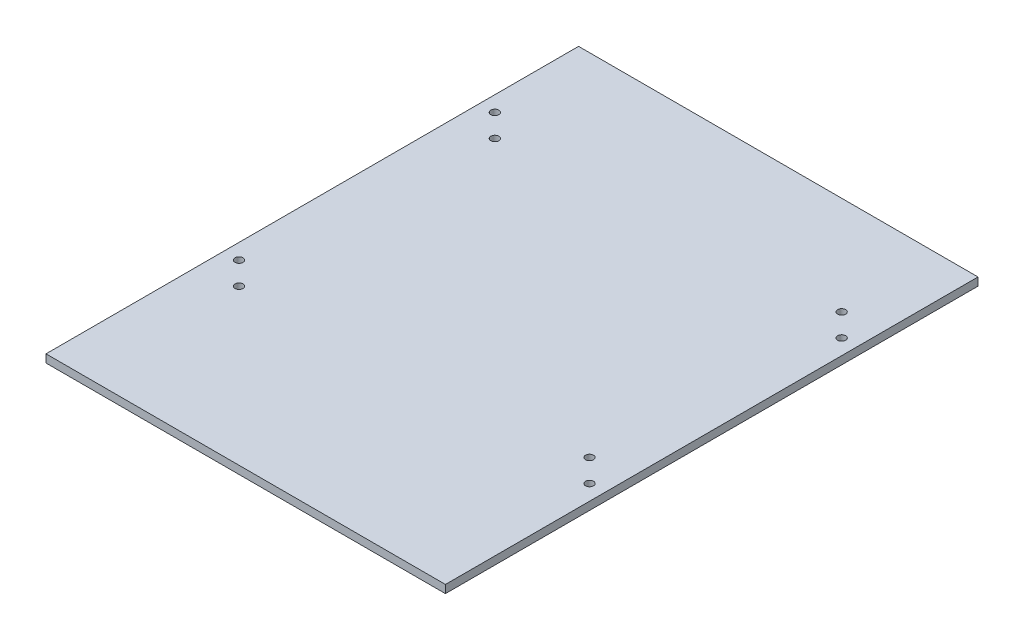
ISO-10303-21;
HEADER;
FILE_DESCRIPTION(('STEP AP214'),'2;1');
FILE_NAME('part.step','',(''),(''),'','','');
FILE_SCHEMA(('AUTOMOTIVE_DESIGN { 1 0 10303 214 1 1 1 1 }'));
ENDSEC;
DATA;
#1=APPLICATION_CONTEXT('core data for automotive mechanical design processes');
#2=APPLICATION_PROTOCOL_DEFINITION('international standard','automotive_design',2000,#1);
#3=PRODUCT_CONTEXT('',#1,'mechanical');
#4=PRODUCT('Part','Part','',(#3));
#5=PRODUCT_RELATED_PRODUCT_CATEGORY('part','',(#4));
#6=PRODUCT_DEFINITION_FORMATION('','',#4);
#7=PRODUCT_DEFINITION_CONTEXT('part definition',#1,'design');
#8=PRODUCT_DEFINITION('design','',#6,#7);
#9=PRODUCT_DEFINITION_SHAPE('','',#8);
#10=(LENGTH_UNIT() NAMED_UNIT(*) SI_UNIT(.MILLI.,.METRE.));
#11=(NAMED_UNIT(*) PLANE_ANGLE_UNIT() SI_UNIT($,.RADIAN.));
#12=(NAMED_UNIT(*) SI_UNIT($,.STERADIAN.) SOLID_ANGLE_UNIT());
#13=UNCERTAINTY_MEASURE_WITH_UNIT(LENGTH_MEASURE(1.E-05),#10,'distance_accuracy_value','');
#14=(GEOMETRIC_REPRESENTATION_CONTEXT(3) GLOBAL_UNCERTAINTY_ASSIGNED_CONTEXT((#13)) GLOBAL_UNIT_ASSIGNED_CONTEXT((#10,
#11,#12)) REPRESENTATION_CONTEXT('',''));
#15=CARTESIAN_POINT('',(0.,0.,0.));
#16=DIRECTION('',(0.,0.,1.));
#17=DIRECTION('',(1.,0.,0.));
#18=AXIS2_PLACEMENT_3D('',#15,#16,#17);
#19=CARTESIAN_POINT('',(0.,3.,0.));
#20=DIRECTION('',(0.,-1.,0.));
#21=DIRECTION('',(0.,0.,-1.));
#22=AXIS2_PLACEMENT_3D('',#19,#20,#21);
#23=PLANE('',#22);
#24=DIRECTION('',(0.,0.,-1.));
#25=VECTOR('',#24,1.);
#26=CARTESIAN_POINT('',(75.,3.,100.));
#27=LINE('',#26,#25);
#28=CARTESIAN_POINT('',(75.,3.,100.));
#29=VERTEX_POINT('',#28);
#30=CARTESIAN_POINT('',(75.,3.,-100.));
#31=VERTEX_POINT('',#30);
#32=EDGE_CURVE('E96',#29,#31,#27,.T.);
#33=ORIENTED_EDGE('',*,*,#32,.T.);
#34=DIRECTION('',(-1.,0.,0.));
#35=VECTOR('',#34,1.);
#36=CARTESIAN_POINT('',(-75.,3.,-100.));
#37=LINE('',#36,#35);
#38=CARTESIAN_POINT('',(-75.,3.,-100.));
#39=VERTEX_POINT('',#38);
#40=EDGE_CURVE('E91',#31,#39,#37,.T.);
#41=ORIENTED_EDGE('',*,*,#40,.T.);
#42=DIRECTION('',(0.,0.,1.));
#43=VECTOR('',#42,1.);
#44=CARTESIAN_POINT('',(-75.,3.,100.));
#45=LINE('',#44,#43);
#46=CARTESIAN_POINT('',(-75.,3.,100.));
#47=VERTEX_POINT('',#46);
#48=EDGE_CURVE('E94',#39,#47,#45,.T.);
#49=ORIENTED_EDGE('',*,*,#48,.T.);
#50=DIRECTION('',(1.,0.,0.));
#51=VECTOR('',#50,1.);
#52=CARTESIAN_POINT('',(-75.,3.,100.));
#53=LINE('',#52,#51);
#54=EDGE_CURVE('E61',#47,#29,#53,.T.);
#55=ORIENTED_EDGE('',*,*,#54,.T.);
#56=EDGE_LOOP('',(#33,#41,#49,#55));
#57=FACE_BOUND('',#56,.T.);
#58=CARTESIAN_POINT('',(-69.2426406871193,3.,-62.7960575902143));
#59=DIRECTION('',(0.,1.,0.));
#60=DIRECTION('',(0.,0.,1.));
#61=AXIS2_PLACEMENT_3D('',#58,#59,#60);
#62=CIRCLE('',#61,1.50000000000001);
#63=CARTESIAN_POINT('',(-69.2426406871193,3.,-61.2960575902143));
#64=VERTEX_POINT('',#63);
#65=EDGE_CURVE('E116',#64,#64,#62,.T.);
#66=ORIENTED_EDGE('',*,*,#65,.F.);
#67=EDGE_LOOP('',(#66));
#68=FACE_BOUND('',#67,.T.);
#69=CARTESIAN_POINT('',(-60.7573593128807,3.,-54.3107762159757));
#70=DIRECTION('',(0.,1.,0.));
#71=DIRECTION('',(0.,0.,1.));
#72=AXIS2_PLACEMENT_3D('',#69,#70,#71);
#73=CIRCLE('',#72,1.5);
#74=CARTESIAN_POINT('',(-60.7573593128807,3.,-52.8107762159757));
#75=VERTEX_POINT('',#74);
#76=EDGE_CURVE('E138',#75,#75,#73,.T.);
#77=ORIENTED_EDGE('',*,*,#76,.F.);
#78=EDGE_LOOP('',(#77));
#79=FACE_BOUND('',#78,.T.);
#80=CARTESIAN_POINT('',(60.7573593128805,3.,-63.0348108441595));
#81=DIRECTION('',(0.,1.,0.));
#82=DIRECTION('',(0.,0.,1.));
#83=AXIS2_PLACEMENT_3D('',#80,#81,#82);
#84=CIRCLE('',#83,1.5);
#85=CARTESIAN_POINT('',(60.7573593128805,3.,-61.5348108441595));
#86=VERTEX_POINT('',#85);
#87=EDGE_CURVE('E146',#86,#86,#84,.T.);
#88=ORIENTED_EDGE('',*,*,#87,.F.);
#89=EDGE_LOOP('',(#88));
#90=FACE_BOUND('',#89,.T.);
#91=CARTESIAN_POINT('',(69.2426406871191,3.,-54.5495294699209));
#92=DIRECTION('',(0.,1.,0.));
#93=DIRECTION('',(0.,0.,1.));
#94=AXIS2_PLACEMENT_3D('',#91,#92,#93);
#95=CIRCLE('',#94,1.5);
#96=CARTESIAN_POINT('',(69.2426406871191,3.,-53.0495294699209));
#97=VERTEX_POINT('',#96);
#98=EDGE_CURVE('E154',#97,#97,#95,.T.);
#99=ORIENTED_EDGE('',*,*,#98,.F.);
#100=EDGE_LOOP('',(#99));
#101=FACE_BOUND('',#100,.T.);
#102=CARTESIAN_POINT('',(-69.2426406871193,3.,33.2742269356956));
#103=DIRECTION('',(0.,1.,0.));
#104=DIRECTION('',(0.,0.,1.));
#105=AXIS2_PLACEMENT_3D('',#102,#103,#104);
#106=CIRCLE('',#105,1.5);
#107=CARTESIAN_POINT('',(-69.2426406871193,3.,34.7742269356956));
#108=VERTEX_POINT('',#107);
#109=EDGE_CURVE('E162',#108,#108,#106,.T.);
#110=ORIENTED_EDGE('',*,*,#109,.F.);
#111=EDGE_LOOP('',(#110));
#112=FACE_BOUND('',#111,.T.);
#113=CARTESIAN_POINT('',(-60.7573593128807,3.,41.7595083099341));
#114=DIRECTION('',(0.,1.,0.));
#115=DIRECTION('',(0.,0.,1.));
#116=AXIS2_PLACEMENT_3D('',#113,#114,#115);
#117=CIRCLE('',#116,1.5);
#118=CARTESIAN_POINT('',(-60.7573593128807,3.,43.2595083099341));
#119=VERTEX_POINT('',#118);
#120=EDGE_CURVE('E170',#119,#119,#117,.T.);
#121=ORIENTED_EDGE('',*,*,#120,.F.);
#122=EDGE_LOOP('',(#121));
#123=FACE_BOUND('',#122,.T.);
#124=CARTESIAN_POINT('',(60.7573593128805,3.,31.6418538542117));
#125=DIRECTION('',(0.,1.,0.));
#126=DIRECTION('',(0.,0.,1.));
#127=AXIS2_PLACEMENT_3D('',#124,#125,#126);
#128=CIRCLE('',#127,1.50000000000001);
#129=CARTESIAN_POINT('',(60.7573593128805,3.,33.1418538542118));
#130=VERTEX_POINT('',#129);
#131=EDGE_CURVE('E178',#130,#130,#128,.T.);
#132=ORIENTED_EDGE('',*,*,#131,.F.);
#133=EDGE_LOOP('',(#132));
#134=FACE_BOUND('',#133,.T.);
#135=CARTESIAN_POINT('',(69.2426406871191,3.,40.1271352284503));
#136=DIRECTION('',(0.,1.,0.));
#137=DIRECTION('',(0.,0.,1.));
#138=AXIS2_PLACEMENT_3D('',#135,#136,#137);
#139=CIRCLE('',#138,1.5);
#140=CARTESIAN_POINT('',(69.2426406871191,3.,41.6271352284503));
#141=VERTEX_POINT('',#140);
#142=EDGE_CURVE('E186',#141,#141,#139,.T.);
#143=ORIENTED_EDGE('',*,*,#142,.F.);
#144=EDGE_LOOP('',(#143));
#145=FACE_BOUND('',#144,.T.);
#146=ADVANCED_FACE('F43',(#57,#68,#79,#90,#101,#112,#123,#134,#145),#23,.F.);
#147=CARTESIAN_POINT('',(0.,0.,0.));
#148=DIRECTION('',(0.,-1.,0.));
#149=DIRECTION('',(0.,0.,-1.));
#150=AXIS2_PLACEMENT_3D('',#147,#148,#149);
#151=PLANE('',#150);
#152=CARTESIAN_POINT('',(60.7573593128805,0.,31.6418538542117));
#153=DIRECTION('',(0.,1.,0.));
#154=DIRECTION('',(0.,0.,1.));
#155=AXIS2_PLACEMENT_3D('',#152,#153,#154);
#156=CIRCLE('',#155,1.50000000000001);
#157=CARTESIAN_POINT('',(60.7573593128805,0.,33.1418538542118));
#158=VERTEX_POINT('',#157);
#159=EDGE_CURVE('E182',#158,#158,#156,.T.);
#160=ORIENTED_EDGE('',*,*,#159,.T.);
#161=EDGE_LOOP('',(#160));
#162=FACE_BOUND('',#161,.T.);
#163=CARTESIAN_POINT('',(-69.2426406871193,0.,33.2742269356956));
#164=DIRECTION('',(0.,1.,0.));
#165=DIRECTION('',(0.,0.,1.));
#166=AXIS2_PLACEMENT_3D('',#163,#164,#165);
#167=CIRCLE('',#166,1.5);
#168=CARTESIAN_POINT('',(-69.2426406871193,0.,34.7742269356956));
#169=VERTEX_POINT('',#168);
#170=EDGE_CURVE('E166',#169,#169,#167,.T.);
#171=ORIENTED_EDGE('',*,*,#170,.T.);
#172=EDGE_LOOP('',(#171));
#173=FACE_BOUND('',#172,.T.);
#174=CARTESIAN_POINT('',(60.7573593128805,0.,-63.0348108441595));
#175=DIRECTION('',(0.,1.,0.));
#176=DIRECTION('',(0.,0.,1.));
#177=AXIS2_PLACEMENT_3D('',#174,#175,#176);
#178=CIRCLE('',#177,1.5);
#179=CARTESIAN_POINT('',(60.7573593128805,0.,-61.5348108441595));
#180=VERTEX_POINT('',#179);
#181=EDGE_CURVE('E150',#180,#180,#178,.T.);
#182=ORIENTED_EDGE('',*,*,#181,.T.);
#183=EDGE_LOOP('',(#182));
#184=FACE_BOUND('',#183,.T.);
#185=CARTESIAN_POINT('',(-69.2426406871193,0.,-62.7960575902143));
#186=DIRECTION('',(0.,1.,0.));
#187=DIRECTION('',(0.,0.,1.));
#188=AXIS2_PLACEMENT_3D('',#185,#186,#187);
#189=CIRCLE('',#188,1.50000000000001);
#190=CARTESIAN_POINT('',(-69.2426406871193,0.,-61.2960575902143));
#191=VERTEX_POINT('',#190);
#192=EDGE_CURVE('E134',#191,#191,#189,.T.);
#193=ORIENTED_EDGE('',*,*,#192,.T.);
#194=EDGE_LOOP('',(#193));
#195=FACE_BOUND('',#194,.T.);
#196=DIRECTION('',(0.,0.,-1.));
#197=VECTOR('',#196,1.);
#198=CARTESIAN_POINT('',(75.,0.,100.));
#199=LINE('',#198,#197);
#200=CARTESIAN_POINT('',(75.,0.,100.));
#201=VERTEX_POINT('',#200);
#202=CARTESIAN_POINT('',(75.,0.,-100.));
#203=VERTEX_POINT('',#202);
#204=EDGE_CURVE('E112',#201,#203,#199,.T.);
#205=ORIENTED_EDGE('',*,*,#204,.F.);
#206=DIRECTION('',(1.,0.,0.));
#207=VECTOR('',#206,1.);
#208=CARTESIAN_POINT('',(-75.,0.,100.));
#209=LINE('',#208,#207);
#210=CARTESIAN_POINT('',(-75.,0.,100.));
#211=VERTEX_POINT('',#210);
#212=EDGE_CURVE('E84',#211,#201,#209,.T.);
#213=ORIENTED_EDGE('',*,*,#212,.F.);
#214=DIRECTION('',(0.,0.,1.));
#215=VECTOR('',#214,1.);
#216=CARTESIAN_POINT('',(-75.,0.,100.));
#217=LINE('',#216,#215);
#218=CARTESIAN_POINT('',(-75.,0.,-100.));
#219=VERTEX_POINT('',#218);
#220=EDGE_CURVE('E78',#219,#211,#217,.T.);
#221=ORIENTED_EDGE('',*,*,#220,.F.);
#222=DIRECTION('',(-1.,0.,0.));
#223=VECTOR('',#222,1.);
#224=CARTESIAN_POINT('',(-75.,0.,-100.));
#225=LINE('',#224,#223);
#226=EDGE_CURVE('E101',#203,#219,#225,.T.);
#227=ORIENTED_EDGE('',*,*,#226,.F.);
#228=EDGE_LOOP('',(#205,#213,#221,#227));
#229=FACE_BOUND('',#228,.T.);
#230=CARTESIAN_POINT('',(-60.7573593128807,0.,-54.3107762159757));
#231=DIRECTION('',(0.,1.,0.));
#232=DIRECTION('',(0.,0.,1.));
#233=AXIS2_PLACEMENT_3D('',#230,#231,#232);
#234=CIRCLE('',#233,1.5);
#235=CARTESIAN_POINT('',(-60.7573593128807,0.,-52.8107762159757));
#236=VERTEX_POINT('',#235);
#237=EDGE_CURVE('E142',#236,#236,#234,.T.);
#238=ORIENTED_EDGE('',*,*,#237,.T.);
#239=EDGE_LOOP('',(#238));
#240=FACE_BOUND('',#239,.T.);
#241=CARTESIAN_POINT('',(69.2426406871191,0.,-54.5495294699209));
#242=DIRECTION('',(0.,1.,0.));
#243=DIRECTION('',(0.,0.,1.));
#244=AXIS2_PLACEMENT_3D('',#241,#242,#243);
#245=CIRCLE('',#244,1.5);
#246=CARTESIAN_POINT('',(69.2426406871191,0.,-53.0495294699209));
#247=VERTEX_POINT('',#246);
#248=EDGE_CURVE('E158',#247,#247,#245,.T.);
#249=ORIENTED_EDGE('',*,*,#248,.T.);
#250=EDGE_LOOP('',(#249));
#251=FACE_BOUND('',#250,.T.);
#252=CARTESIAN_POINT('',(-60.7573593128807,0.,41.7595083099341));
#253=DIRECTION('',(0.,1.,0.));
#254=DIRECTION('',(0.,0.,1.));
#255=AXIS2_PLACEMENT_3D('',#252,#253,#254);
#256=CIRCLE('',#255,1.5);
#257=CARTESIAN_POINT('',(-60.7573593128807,0.,43.2595083099341));
#258=VERTEX_POINT('',#257);
#259=EDGE_CURVE('E174',#258,#258,#256,.T.);
#260=ORIENTED_EDGE('',*,*,#259,.T.);
#261=EDGE_LOOP('',(#260));
#262=FACE_BOUND('',#261,.T.);
#263=CARTESIAN_POINT('',(69.2426406871191,0.,40.1271352284503));
#264=DIRECTION('',(0.,1.,0.));
#265=DIRECTION('',(0.,0.,1.));
#266=AXIS2_PLACEMENT_3D('',#263,#264,#265);
#267=CIRCLE('',#266,1.5);
#268=CARTESIAN_POINT('',(69.2426406871191,0.,41.6271352284503));
#269=VERTEX_POINT('',#268);
#270=EDGE_CURVE('E190',#269,#269,#267,.T.);
#271=ORIENTED_EDGE('',*,*,#270,.T.);
#272=EDGE_LOOP('',(#271));
#273=FACE_BOUND('',#272,.T.);
#274=ADVANCED_FACE('F129',(#162,#173,#184,#195,#229,#240,#251,#262,#273),#151,.T.);
#275=CARTESIAN_POINT('',(75.,3.,100.));
#276=DIRECTION('',(-1.,0.,0.));
#277=DIRECTION('',(0.,0.,1.));
#278=AXIS2_PLACEMENT_3D('',#275,#276,#277);
#279=PLANE('',#278);
#280=ORIENTED_EDGE('',*,*,#204,.T.);
#281=DIRECTION('',(0.,-1.,0.));
#282=VECTOR('',#281,1.);
#283=CARTESIAN_POINT('',(75.,3.,-100.));
#284=LINE('',#283,#282);
#285=EDGE_CURVE('E11',#31,#203,#284,.T.);
#286=ORIENTED_EDGE('',*,*,#285,.F.);
#287=ORIENTED_EDGE('',*,*,#32,.F.);
#288=DIRECTION('',(0.,-1.,0.));
#289=VECTOR('',#288,1.);
#290=CARTESIAN_POINT('',(75.,3.,100.));
#291=LINE('',#290,#289);
#292=EDGE_CURVE('E108',#29,#201,#291,.T.);
#293=ORIENTED_EDGE('',*,*,#292,.T.);
#294=EDGE_LOOP('',(#280,#286,#287,#293));
#295=FACE_BOUND('',#294,.T.);
#296=ADVANCED_FACE('F45',(#295),#279,.F.);
#297=CARTESIAN_POINT('',(-75.,3.,-100.));
#298=DIRECTION('',(0.,0.,1.));
#299=DIRECTION('',(1.,0.,0.));
#300=AXIS2_PLACEMENT_3D('',#297,#298,#299);
#301=PLANE('',#300);
#302=ORIENTED_EDGE('',*,*,#226,.T.);
#303=DIRECTION('',(0.,-1.,0.));
#304=VECTOR('',#303,1.);
#305=CARTESIAN_POINT('',(-75.,3.,-100.));
#306=LINE('',#305,#304);
#307=EDGE_CURVE('E53',#39,#219,#306,.T.);
#308=ORIENTED_EDGE('',*,*,#307,.F.);
#309=ORIENTED_EDGE('',*,*,#40,.F.);
#310=ORIENTED_EDGE('',*,*,#285,.T.);
#311=EDGE_LOOP('',(#302,#308,#309,#310));
#312=FACE_BOUND('',#311,.T.);
#313=ADVANCED_FACE('F100',(#312),#301,.F.);
#314=CARTESIAN_POINT('',(-75.,3.,100.));
#315=DIRECTION('',(1.,0.,0.));
#316=DIRECTION('',(0.,0.,-1.));
#317=AXIS2_PLACEMENT_3D('',#314,#315,#316);
#318=PLANE('',#317);
#319=ORIENTED_EDGE('',*,*,#220,.T.);
#320=DIRECTION('',(0.,-1.,0.));
#321=VECTOR('',#320,1.);
#322=CARTESIAN_POINT('',(-75.,3.,100.));
#323=LINE('',#322,#321);
#324=EDGE_CURVE('E103',#47,#211,#323,.T.);
#325=ORIENTED_EDGE('',*,*,#324,.F.);
#326=ORIENTED_EDGE('',*,*,#48,.F.);
#327=ORIENTED_EDGE('',*,*,#307,.T.);
#328=EDGE_LOOP('',(#319,#325,#326,#327));
#329=FACE_BOUND('',#328,.T.);
#330=ADVANCED_FACE('F104',(#329),#318,.F.);
#331=CARTESIAN_POINT('',(-75.,3.,100.));
#332=DIRECTION('',(0.,0.,-1.));
#333=DIRECTION('',(-1.,0.,0.));
#334=AXIS2_PLACEMENT_3D('',#331,#332,#333);
#335=PLANE('',#334);
#336=ORIENTED_EDGE('',*,*,#212,.T.);
#337=ORIENTED_EDGE('',*,*,#292,.F.);
#338=ORIENTED_EDGE('',*,*,#54,.F.);
#339=ORIENTED_EDGE('',*,*,#324,.T.);
#340=EDGE_LOOP('',(#336,#337,#338,#339));
#341=FACE_BOUND('',#340,.T.);
#342=ADVANCED_FACE('F126',(#341),#335,.F.);
#343=CARTESIAN_POINT('',(-69.2426406871193,3.,-62.7960575902143));
#344=DIRECTION('',(0.,-1.,0.));
#345=DIRECTION('',(0.,0.,-1.));
#346=AXIS2_PLACEMENT_3D('',#343,#344,#345);
#347=CYLINDRICAL_SURFACE('',#346,1.50000000000001);
#348=ORIENTED_EDGE('',*,*,#65,.T.);
#349=EDGE_LOOP('',(#348));
#350=FACE_BOUND('',#349,.T.);
#351=ORIENTED_EDGE('',*,*,#192,.F.);
#352=EDGE_LOOP('',(#351));
#353=FACE_BOUND('',#352,.T.);
#354=ADVANCED_FACE('F209',(#350,#353),#347,.F.);
#355=CARTESIAN_POINT('',(-60.7573593128807,3.,-54.3107762159757));
#356=DIRECTION('',(0.,-1.,0.));
#357=DIRECTION('',(0.,0.,-1.));
#358=AXIS2_PLACEMENT_3D('',#355,#356,#357);
#359=CYLINDRICAL_SURFACE('',#358,1.5);
#360=ORIENTED_EDGE('',*,*,#76,.T.);
#361=EDGE_LOOP('',(#360));
#362=FACE_BOUND('',#361,.T.);
#363=ORIENTED_EDGE('',*,*,#237,.F.);
#364=EDGE_LOOP('',(#363));
#365=FACE_BOUND('',#364,.T.);
#366=ADVANCED_FACE('F263',(#362,#365),#359,.F.);
#367=CARTESIAN_POINT('',(60.7573593128805,3.,-63.0348108441595));
#368=DIRECTION('',(0.,-1.,0.));
#369=DIRECTION('',(0.,0.,-1.));
#370=AXIS2_PLACEMENT_3D('',#367,#368,#369);
#371=CYLINDRICAL_SURFACE('',#370,1.5);
#372=ORIENTED_EDGE('',*,*,#87,.T.);
#373=EDGE_LOOP('',(#372));
#374=FACE_BOUND('',#373,.T.);
#375=ORIENTED_EDGE('',*,*,#181,.F.);
#376=EDGE_LOOP('',(#375));
#377=FACE_BOUND('',#376,.T.);
#378=ADVANCED_FACE('F272',(#374,#377),#371,.F.);
#379=CARTESIAN_POINT('',(69.2426406871191,3.,-54.5495294699209));
#380=DIRECTION('',(0.,-1.,0.));
#381=DIRECTION('',(0.,0.,-1.));
#382=AXIS2_PLACEMENT_3D('',#379,#380,#381);
#383=CYLINDRICAL_SURFACE('',#382,1.5);
#384=ORIENTED_EDGE('',*,*,#98,.T.);
#385=EDGE_LOOP('',(#384));
#386=FACE_BOUND('',#385,.T.);
#387=ORIENTED_EDGE('',*,*,#248,.F.);
#388=EDGE_LOOP('',(#387));
#389=FACE_BOUND('',#388,.T.);
#390=ADVANCED_FACE('F281',(#386,#389),#383,.F.);
#391=CARTESIAN_POINT('',(-69.2426406871193,3.,33.2742269356956));
#392=DIRECTION('',(0.,-1.,0.));
#393=DIRECTION('',(0.,0.,-1.));
#394=AXIS2_PLACEMENT_3D('',#391,#392,#393);
#395=CYLINDRICAL_SURFACE('',#394,1.5);
#396=ORIENTED_EDGE('',*,*,#109,.T.);
#397=EDGE_LOOP('',(#396));
#398=FACE_BOUND('',#397,.T.);
#399=ORIENTED_EDGE('',*,*,#170,.F.);
#400=EDGE_LOOP('',(#399));
#401=FACE_BOUND('',#400,.T.);
#402=ADVANCED_FACE('F291',(#398,#401),#395,.F.);
#403=CARTESIAN_POINT('',(-60.7573593128807,3.,41.7595083099341));
#404=DIRECTION('',(0.,-1.,0.));
#405=DIRECTION('',(0.,0.,-1.));
#406=AXIS2_PLACEMENT_3D('',#403,#404,#405);
#407=CYLINDRICAL_SURFACE('',#406,1.5);
#408=ORIENTED_EDGE('',*,*,#120,.T.);
#409=EDGE_LOOP('',(#408));
#410=FACE_BOUND('',#409,.T.);
#411=ORIENTED_EDGE('',*,*,#259,.F.);
#412=EDGE_LOOP('',(#411));
#413=FACE_BOUND('',#412,.T.);
#414=ADVANCED_FACE('F301',(#410,#413),#407,.F.);
#415=CARTESIAN_POINT('',(60.7573593128805,3.,31.6418538542117));
#416=DIRECTION('',(0.,-1.,0.));
#417=DIRECTION('',(0.,0.,-1.));
#418=AXIS2_PLACEMENT_3D('',#415,#416,#417);
#419=CYLINDRICAL_SURFACE('',#418,1.50000000000001);
#420=ORIENTED_EDGE('',*,*,#131,.T.);
#421=EDGE_LOOP('',(#420));
#422=FACE_BOUND('',#421,.T.);
#423=ORIENTED_EDGE('',*,*,#159,.F.);
#424=EDGE_LOOP('',(#423));
#425=FACE_BOUND('',#424,.T.);
#426=ADVANCED_FACE('F311',(#422,#425),#419,.F.);
#427=CARTESIAN_POINT('',(69.2426406871191,3.,40.1271352284503));
#428=DIRECTION('',(0.,-1.,0.));
#429=DIRECTION('',(0.,0.,-1.));
#430=AXIS2_PLACEMENT_3D('',#427,#428,#429);
#431=CYLINDRICAL_SURFACE('',#430,1.5);
#432=ORIENTED_EDGE('',*,*,#142,.T.);
#433=EDGE_LOOP('',(#432));
#434=FACE_BOUND('',#433,.T.);
#435=ORIENTED_EDGE('',*,*,#270,.F.);
#436=EDGE_LOOP('',(#435));
#437=FACE_BOUND('',#436,.T.);
#438=ADVANCED_FACE('F198',(#434,#437),#431,.F.);
#439=CLOSED_SHELL('',(#146,#274,#296,#313,#330,#342,#354,#366,#378,#390,#402,#414,#426,#438));
#440=MANIFOLD_SOLID_BREP('B2',#439);
#441=ADVANCED_BREP_SHAPE_REPRESENTATION('',(#18,#440),#14);
#442=SHAPE_DEFINITION_REPRESENTATION(#9,#441);
ENDSEC;
END-ISO-10303-21;
